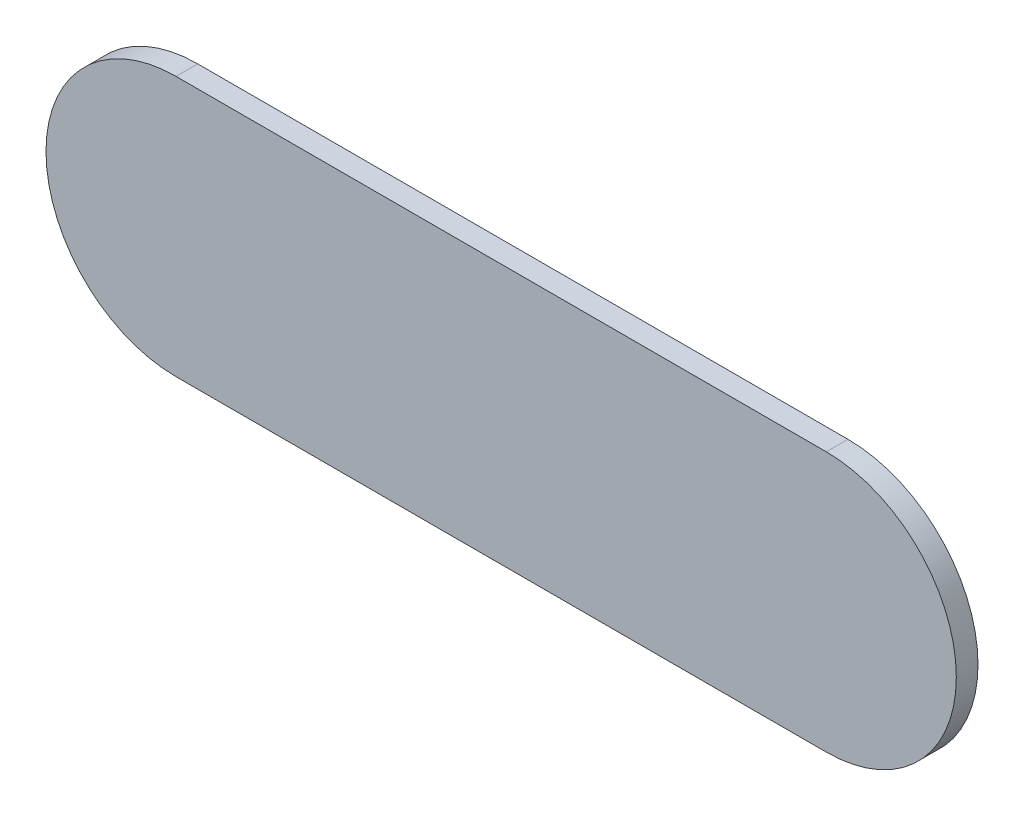
ISO-10303-21;
HEADER;
FILE_DESCRIPTION(('STEP AP214'),'2;1');
FILE_NAME('part.step','',(''),(''),'','','');
FILE_SCHEMA(('AUTOMOTIVE_DESIGN { 1 0 10303 214 1 1 1 1 }'));
ENDSEC;
DATA;
#1=APPLICATION_CONTEXT('core data for automotive mechanical design processes');
#2=APPLICATION_PROTOCOL_DEFINITION('international standard','automotive_design',2000,#1);
#3=PRODUCT_CONTEXT('',#1,'mechanical');
#4=PRODUCT('Part','Part','',(#3));
#5=PRODUCT_RELATED_PRODUCT_CATEGORY('part','',(#4));
#6=PRODUCT_DEFINITION_FORMATION('','',#4);
#7=PRODUCT_DEFINITION_CONTEXT('part definition',#1,'design');
#8=PRODUCT_DEFINITION('design','',#6,#7);
#9=PRODUCT_DEFINITION_SHAPE('','',#8);
#10=(LENGTH_UNIT() NAMED_UNIT(*) SI_UNIT(.MILLI.,.METRE.));
#11=(NAMED_UNIT(*) PLANE_ANGLE_UNIT() SI_UNIT($,.RADIAN.));
#12=(NAMED_UNIT(*) SI_UNIT($,.STERADIAN.) SOLID_ANGLE_UNIT());
#13=UNCERTAINTY_MEASURE_WITH_UNIT(LENGTH_MEASURE(1.E-05),#10,'distance_accuracy_value','');
#14=(GEOMETRIC_REPRESENTATION_CONTEXT(3) GLOBAL_UNCERTAINTY_ASSIGNED_CONTEXT((#13)) GLOBAL_UNIT_ASSIGNED_CONTEXT((#10,
#11,#12)) REPRESENTATION_CONTEXT('',''));
#15=CARTESIAN_POINT('',(0.,0.,0.));
#16=DIRECTION('',(0.,0.,1.));
#17=DIRECTION('',(1.,0.,0.));
#18=AXIS2_PLACEMENT_3D('',#15,#16,#17);
#19=CARTESIAN_POINT('',(-15.,0.,1.));
#20=DIRECTION('',(0.,0.,-1.));
#21=DIRECTION('',(-1.,0.,0.));
#22=AXIS2_PLACEMENT_3D('',#19,#20,#21);
#23=CYLINDRICAL_SURFACE('',#22,6.);
#24=CARTESIAN_POINT('',(-15.,0.,0.));
#25=DIRECTION('',(0.,0.,1.));
#26=DIRECTION('',(1.,0.,0.));
#27=AXIS2_PLACEMENT_3D('',#24,#25,#26);
#28=CIRCLE('',#27,6.);
#29=CARTESIAN_POINT('',(-15.,6.,0.));
#30=VERTEX_POINT('',#29);
#31=CARTESIAN_POINT('',(-15.,-6.,0.));
#32=VERTEX_POINT('',#31);
#33=EDGE_CURVE('E96',#30,#32,#28,.T.);
#34=ORIENTED_EDGE('',*,*,#33,.T.);
#35=DIRECTION('',(0.,0.,-1.));
#36=VECTOR('',#35,1.);
#37=CARTESIAN_POINT('',(-15.,-6.,1.));
#38=LINE('',#37,#36);
#39=CARTESIAN_POINT('',(-15.,-6.,1.));
#40=VERTEX_POINT('',#39);
#41=EDGE_CURVE('E11',#40,#32,#38,.T.);
#42=ORIENTED_EDGE('',*,*,#41,.F.);
#43=CARTESIAN_POINT('',(-15.,0.,1.));
#44=DIRECTION('',(0.,0.,1.));
#45=DIRECTION('',(1.,0.,0.));
#46=AXIS2_PLACEMENT_3D('',#43,#44,#45);
#47=CIRCLE('',#46,6.);
#48=CARTESIAN_POINT('',(-15.,6.,1.));
#49=VERTEX_POINT('',#48);
#50=EDGE_CURVE('E84',#49,#40,#47,.T.);
#51=ORIENTED_EDGE('',*,*,#50,.F.);
#52=DIRECTION('',(0.,0.,-1.));
#53=VECTOR('',#52,1.);
#54=CARTESIAN_POINT('',(-15.,6.,1.));
#55=LINE('',#54,#53);
#56=EDGE_CURVE('E92',#49,#30,#55,.T.);
#57=ORIENTED_EDGE('',*,*,#56,.T.);
#58=EDGE_LOOP('',(#34,#42,#51,#57));
#59=FACE_BOUND('',#58,.T.);
#60=ADVANCED_FACE('F33',(#59),#23,.T.);
#61=CARTESIAN_POINT('',(-15.,-6.,1.));
#62=DIRECTION('',(0.,1.,0.));
#63=DIRECTION('',(-1.,0.,0.));
#64=AXIS2_PLACEMENT_3D('',#61,#62,#63);
#65=PLANE('',#64);
#66=DIRECTION('',(1.,0.,0.));
#67=VECTOR('',#66,1.);
#68=CARTESIAN_POINT('',(-15.,-6.,0.));
#69=LINE('',#68,#67);
#70=CARTESIAN_POINT('',(15.,-6.,0.));
#71=VERTEX_POINT('',#70);
#72=EDGE_CURVE('E88',#32,#71,#69,.T.);
#73=ORIENTED_EDGE('',*,*,#72,.T.);
#74=DIRECTION('',(0.,0.,-1.));
#75=VECTOR('',#74,1.);
#76=CARTESIAN_POINT('',(15.,-6.,1.));
#77=LINE('',#76,#75);
#78=CARTESIAN_POINT('',(15.,-6.,1.));
#79=VERTEX_POINT('',#78);
#80=EDGE_CURVE('E41',#79,#71,#77,.T.);
#81=ORIENTED_EDGE('',*,*,#80,.F.);
#82=DIRECTION('',(1.,0.,0.));
#83=VECTOR('',#82,1.);
#84=CARTESIAN_POINT('',(-15.,-6.,1.));
#85=LINE('',#84,#83);
#86=EDGE_CURVE('E79',#40,#79,#85,.T.);
#87=ORIENTED_EDGE('',*,*,#86,.F.);
#88=ORIENTED_EDGE('',*,*,#41,.T.);
#89=EDGE_LOOP('',(#73,#81,#87,#88));
#90=FACE_BOUND('',#89,.T.);
#91=ADVANCED_FACE('F87',(#90),#65,.F.);
#92=CARTESIAN_POINT('',(15.,0.,1.));
#93=DIRECTION('',(0.,0.,-1.));
#94=DIRECTION('',(-1.,0.,0.));
#95=AXIS2_PLACEMENT_3D('',#92,#93,#94);
#96=CYLINDRICAL_SURFACE('',#95,6.);
#97=CARTESIAN_POINT('',(15.,0.,0.));
#98=DIRECTION('',(0.,0.,1.));
#99=DIRECTION('',(1.,0.,0.));
#100=AXIS2_PLACEMENT_3D('',#97,#98,#99);
#101=CIRCLE('',#100,6.);
#102=CARTESIAN_POINT('',(15.,6.,0.));
#103=VERTEX_POINT('',#102);
#104=EDGE_CURVE('E66',#71,#103,#101,.T.);
#105=ORIENTED_EDGE('',*,*,#104,.T.);
#106=DIRECTION('',(0.,0.,-1.));
#107=VECTOR('',#106,1.);
#108=CARTESIAN_POINT('',(15.,6.,1.));
#109=LINE('',#108,#107);
#110=CARTESIAN_POINT('',(15.,6.,1.));
#111=VERTEX_POINT('',#110);
#112=EDGE_CURVE('E89',#111,#103,#109,.T.);
#113=ORIENTED_EDGE('',*,*,#112,.F.);
#114=CARTESIAN_POINT('',(15.,0.,1.));
#115=DIRECTION('',(0.,0.,1.));
#116=DIRECTION('',(1.,0.,0.));
#117=AXIS2_PLACEMENT_3D('',#114,#115,#116);
#118=CIRCLE('',#117,6.);
#119=EDGE_CURVE('E82',#79,#111,#118,.T.);
#120=ORIENTED_EDGE('',*,*,#119,.F.);
#121=ORIENTED_EDGE('',*,*,#80,.T.);
#122=EDGE_LOOP('',(#105,#113,#120,#121));
#123=FACE_BOUND('',#122,.T.);
#124=ADVANCED_FACE('F90',(#123),#96,.T.);
#125=CARTESIAN_POINT('',(-15.,6.,1.));
#126=DIRECTION('',(0.,-1.,0.));
#127=DIRECTION('',(1.,0.,0.));
#128=AXIS2_PLACEMENT_3D('',#125,#126,#127);
#129=PLANE('',#128);
#130=DIRECTION('',(-1.,0.,0.));
#131=VECTOR('',#130,1.);
#132=CARTESIAN_POINT('',(-15.,6.,0.));
#133=LINE('',#132,#131);
#134=EDGE_CURVE('E72',#103,#30,#133,.T.);
#135=ORIENTED_EDGE('',*,*,#134,.T.);
#136=ORIENTED_EDGE('',*,*,#56,.F.);
#137=DIRECTION('',(-1.,0.,0.));
#138=VECTOR('',#137,1.);
#139=CARTESIAN_POINT('',(-15.,6.,1.));
#140=LINE('',#139,#138);
#141=EDGE_CURVE('E49',#111,#49,#140,.T.);
#142=ORIENTED_EDGE('',*,*,#141,.F.);
#143=ORIENTED_EDGE('',*,*,#112,.T.);
#144=EDGE_LOOP('',(#135,#136,#142,#143));
#145=FACE_BOUND('',#144,.T.);
#146=ADVANCED_FACE('F103',(#145),#129,.F.);
#147=CARTESIAN_POINT('',(-15.,0.,1.));
#148=DIRECTION('',(0.,0.,1.));
#149=DIRECTION('',(1.,0.,0.));
#150=AXIS2_PLACEMENT_3D('',#147,#148,#149);
#151=PLANE('',#150);
#152=ORIENTED_EDGE('',*,*,#50,.T.);
#153=ORIENTED_EDGE('',*,*,#86,.T.);
#154=ORIENTED_EDGE('',*,*,#119,.T.);
#155=ORIENTED_EDGE('',*,*,#141,.T.);
#156=EDGE_LOOP('',(#152,#153,#154,#155));
#157=FACE_BOUND('',#156,.T.);
#158=ADVANCED_FACE('F80',(#157),#151,.T.);
#159=CARTESIAN_POINT('',(-15.,0.,0.));
#160=DIRECTION('',(0.,0.,1.));
#161=DIRECTION('',(1.,0.,0.));
#162=AXIS2_PLACEMENT_3D('',#159,#160,#161);
#163=PLANE('',#162);
#164=ORIENTED_EDGE('',*,*,#33,.F.);
#165=ORIENTED_EDGE('',*,*,#134,.F.);
#166=ORIENTED_EDGE('',*,*,#104,.F.);
#167=ORIENTED_EDGE('',*,*,#72,.F.);
#168=EDGE_LOOP('',(#164,#165,#166,#167));
#169=FACE_BOUND('',#168,.T.);
#170=ADVANCED_FACE('F106',(#169),#163,.F.);
#171=CLOSED_SHELL('',(#60,#91,#124,#146,#158,#170));
#172=MANIFOLD_SOLID_BREP('B2',#171);
#173=ADVANCED_BREP_SHAPE_REPRESENTATION('',(#18,#172),#14);
#174=SHAPE_DEFINITION_REPRESENTATION(#9,#173);
ENDSEC;
END-ISO-10303-21;
